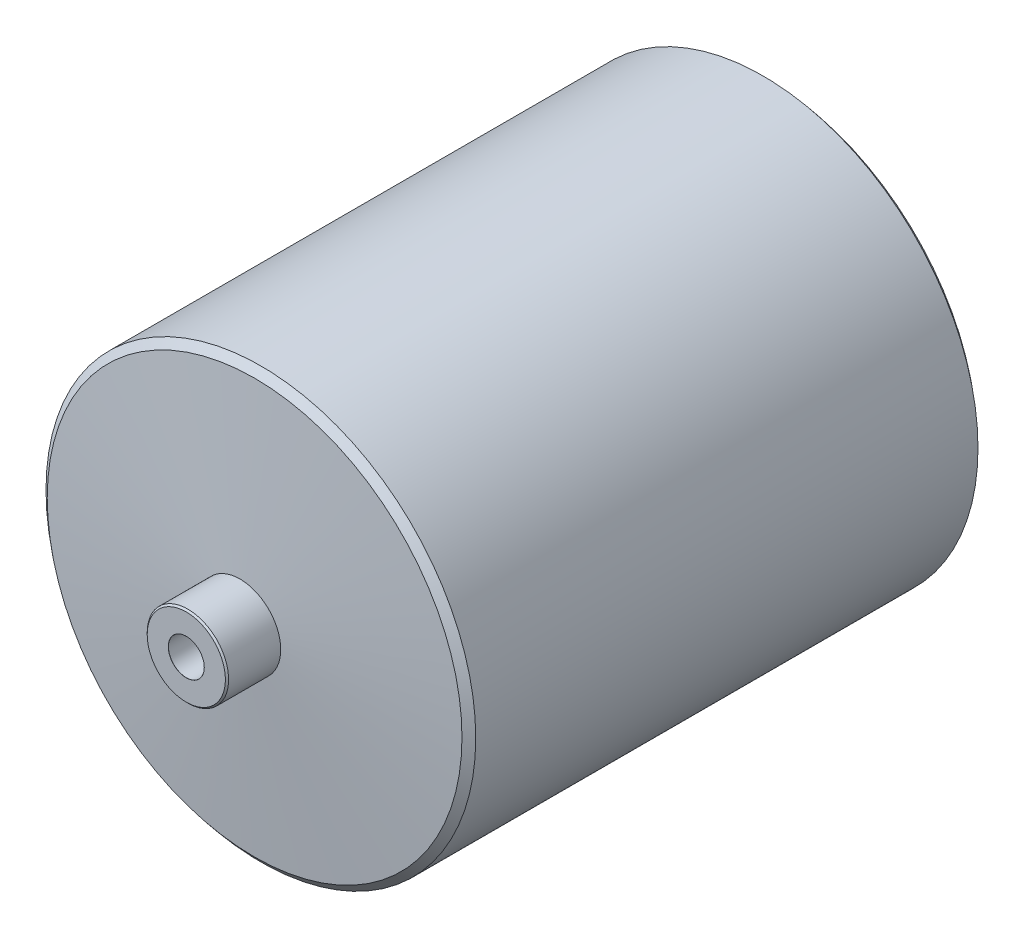
ISO-10303-21;
HEADER;
FILE_DESCRIPTION(('STEP AP214'),'2;1');
FILE_NAME('part.step','',(''),(''),'','','');
FILE_SCHEMA(('AUTOMOTIVE_DESIGN { 1 0 10303 214 1 1 1 1 }'));
ENDSEC;
DATA;
#1=APPLICATION_CONTEXT('core data for automotive mechanical design processes');
#2=APPLICATION_PROTOCOL_DEFINITION('international standard','automotive_design',2000,#1);
#3=PRODUCT_CONTEXT('',#1,'mechanical');
#4=PRODUCT('Part','Part','',(#3));
#5=PRODUCT_RELATED_PRODUCT_CATEGORY('part','',(#4));
#6=PRODUCT_DEFINITION_FORMATION('','',#4);
#7=PRODUCT_DEFINITION_CONTEXT('part definition',#1,'design');
#8=PRODUCT_DEFINITION('design','',#6,#7);
#9=PRODUCT_DEFINITION_SHAPE('','',#8);
#10=(LENGTH_UNIT() NAMED_UNIT(*) SI_UNIT(.MILLI.,.METRE.));
#11=(NAMED_UNIT(*) PLANE_ANGLE_UNIT() SI_UNIT($,.RADIAN.));
#12=(NAMED_UNIT(*) SI_UNIT($,.STERADIAN.) SOLID_ANGLE_UNIT());
#13=UNCERTAINTY_MEASURE_WITH_UNIT(LENGTH_MEASURE(1.E-05),#10,'distance_accuracy_value','');
#14=(GEOMETRIC_REPRESENTATION_CONTEXT(3) GLOBAL_UNCERTAINTY_ASSIGNED_CONTEXT((#13)) GLOBAL_UNIT_ASSIGNED_CONTEXT((#10,
#11,#12)) REPRESENTATION_CONTEXT('',''));
#15=CARTESIAN_POINT('',(0.,0.,0.));
#16=DIRECTION('',(0.,0.,1.));
#17=DIRECTION('',(1.,0.,0.));
#18=AXIS2_PLACEMENT_3D('',#15,#16,#17);
#19=CARTESIAN_POINT('',(0.,12.5,100.));
#20=DIRECTION('',(0.,0.,-1.));
#21=DIRECTION('',(-1.,0.,0.));
#22=AXIS2_PLACEMENT_3D('',#19,#20,#21);
#23=PLANE('',#22);
#24=CARTESIAN_POINT('',(0.,0.,100.));
#25=DIRECTION('',(0.,0.,-1.));
#26=DIRECTION('',(-1.,0.,0.));
#27=AXIS2_PLACEMENT_3D('',#24,#25,#26);
#28=CIRCLE('',#27,12.0000000000001);
#29=CARTESIAN_POINT('',(-12.0000000000001,0.,100.));
#30=VERTEX_POINT('',#29);
#31=EDGE_CURVE('E49',#30,#30,#28,.F.);
#32=ORIENTED_EDGE('',*,*,#31,.T.);
#33=EDGE_LOOP('',(#32));
#34=FACE_BOUND('',#33,.T.);
#35=CARTESIAN_POINT('',(0.,0.,100.));
#36=DIRECTION('',(0.,0.,1.));
#37=DIRECTION('',(1.,0.,0.));
#38=AXIS2_PLACEMENT_3D('',#35,#36,#37);
#39=CIRCLE('',#38,5.525);
#40=CARTESIAN_POINT('',(5.525,0.,100.));
#41=VERTEX_POINT('',#40);
#42=EDGE_CURVE('E65',#41,#41,#39,.T.);
#43=ORIENTED_EDGE('',*,*,#42,.F.);
#44=EDGE_LOOP('',(#43));
#45=FACE_BOUND('',#44,.T.);
#46=ADVANCED_FACE('F40',(#34,#45),#23,.F.);
#47=CARTESIAN_POINT('',(0.,12.5,-100.));
#48=DIRECTION('',(0.,0.,1.));
#49=DIRECTION('',(1.,0.,0.));
#50=AXIS2_PLACEMENT_3D('',#47,#48,#49);
#51=PLANE('',#50);
#52=CARTESIAN_POINT('',(0.,0.,-100.));
#53=DIRECTION('',(0.,0.,1.));
#54=DIRECTION('',(1.,0.,0.));
#55=AXIS2_PLACEMENT_3D('',#52,#53,#54);
#56=CIRCLE('',#55,12.);
#57=CARTESIAN_POINT('',(12.,0.,-100.));
#58=VERTEX_POINT('',#57);
#59=EDGE_CURVE('E102',#58,#58,#56,.F.);
#60=ORIENTED_EDGE('',*,*,#59,.T.);
#61=EDGE_LOOP('',(#60));
#62=FACE_BOUND('',#61,.T.);
#63=CARTESIAN_POINT('',(0.,0.,-100.));
#64=DIRECTION('',(0.,0.,-1.));
#65=DIRECTION('',(-1.,0.,0.));
#66=AXIS2_PLACEMENT_3D('',#63,#64,#65);
#67=CIRCLE('',#66,5.525);
#68=CARTESIAN_POINT('',(-5.525,0.,-100.));
#69=VERTEX_POINT('',#68);
#70=EDGE_CURVE('E72',#69,#69,#67,.T.);
#71=ORIENTED_EDGE('',*,*,#70,.F.);
#72=EDGE_LOOP('',(#71));
#73=FACE_BOUND('',#72,.T.);
#74=ADVANCED_FACE('F119',(#62,#73),#51,.F.);
#75=CARTESIAN_POINT('',(0.,0.,100.));
#76=DIRECTION('',(0.,0.,1.));
#77=DIRECTION('',(1.,0.,0.));
#78=AXIS2_PLACEMENT_3D('',#75,#76,#77);
#79=CYLINDRICAL_SURFACE('',#78,12.5);
#80=CARTESIAN_POINT('',(0.,0.,-99.5));
#81=DIRECTION('',(0.,0.,1.));
#82=DIRECTION('',(1.,0.,0.));
#83=AXIS2_PLACEMENT_3D('',#80,#81,#82);
#84=CIRCLE('',#83,12.5);
#85=CARTESIAN_POINT('',(12.5,0.,-99.5));
#86=VERTEX_POINT('',#85);
#87=EDGE_CURVE('E99',#86,#86,#84,.T.);
#88=ORIENTED_EDGE('',*,*,#87,.T.);
#89=EDGE_LOOP('',(#88));
#90=FACE_BOUND('',#89,.T.);
#91=CARTESIAN_POINT('',(0.,0.,-83.5));
#92=DIRECTION('',(0.,0.,1.));
#93=DIRECTION('',(1.,0.,0.));
#94=AXIS2_PLACEMENT_3D('',#91,#92,#93);
#95=CIRCLE('',#94,12.5);
#96=CARTESIAN_POINT('',(12.4999999999999,0.,-83.5));
#97=VERTEX_POINT('',#96);
#98=EDGE_CURVE('E96',#97,#97,#95,.T.);
#99=ORIENTED_EDGE('',*,*,#98,.F.);
#100=EDGE_LOOP('',(#99));
#101=FACE_BOUND('',#100,.T.);
#102=ADVANCED_FACE('F124',(#90,#101),#79,.T.);
#103=CARTESIAN_POINT('',(0.,0.,-83.5));
#104=DIRECTION('',(0.,0.,1.));
#105=DIRECTION('',(1.,0.,0.));
#106=AXIS2_PLACEMENT_3D('',#103,#104,#105);
#107=CONICAL_SURFACE('',#106,12.5,1.48352986419518);
#108=CARTESIAN_POINT('',(0.,0.,-79.0234400189501));
#109=DIRECTION('',(0.,0.,1.));
#110=DIRECTION('',(1.,0.,0.));
#111=AXIS2_PLACEMENT_3D('',#108,#109,#110);
#112=CIRCLE('',#111,63.6673147198462);
#113=CARTESIAN_POINT('',(63.6673147198461,0.,-79.0234400189501));
#114=VERTEX_POINT('',#113);
#115=EDGE_CURVE('E93',#114,#114,#112,.T.);
#116=CARTESIAN_POINT('',(63.6673147198461,0.,-79.0234400189501));
#117=CARTESIAN_POINT('',(63.1343218581811,0.,-79.070070852086));
#118=CARTESIAN_POINT('',(62.601328996516,0.,-79.116701685222));
#119=CARTESIAN_POINT('',(61.5353432731859,0.,-79.2099633514939));
#120=CARTESIAN_POINT('',(61.0023504115208,0.,-79.2565941846298));
#121=CARTESIAN_POINT('',(59.9363646881907,0.,-79.3498558509017));
#122=CARTESIAN_POINT('',(59.4033718265256,0.,-79.3964866840376));
#123=CARTESIAN_POINT('',(58.3373861031955,0.,-79.4897483503095));
#124=CARTESIAN_POINT('',(57.8043932415304,0.,-79.5363791834454));
#125=CARTESIAN_POINT('',(56.7384075182003,0.,-79.6296408497173));
#126=CARTESIAN_POINT('',(56.2054146565352,0.,-79.6762716828532));
#127=CARTESIAN_POINT('',(55.1394289332051,0.,-79.7695333491251));
#128=CARTESIAN_POINT('',(54.60643607154,0.,-79.816164182261));
#129=CARTESIAN_POINT('',(53.5404503482099,0.,-79.9094258485329));
#130=CARTESIAN_POINT('',(53.0074574865448,0.,-79.9560566816688));
#131=CARTESIAN_POINT('',(51.9414717632147,0.,-80.0493183479407));
#132=CARTESIAN_POINT('',(51.4084789015496,0.,-80.0959491810766));
#133=CARTESIAN_POINT('',(50.3424931782195,0.,-80.1892108473485));
#134=CARTESIAN_POINT('',(49.8095003165544,0.,-80.2358416804845));
#135=CARTESIAN_POINT('',(48.7435145932243,0.,-80.3291033467563));
#136=CARTESIAN_POINT('',(48.2105217315592,0.,-80.3757341798923));
#137=CARTESIAN_POINT('',(47.1445360082291,0.,-80.4689958461641));
#138=CARTESIAN_POINT('',(46.6115431465641,0.,-80.5156266793001));
#139=CARTESIAN_POINT('',(45.5455574232339,0.,-80.608888345572));
#140=CARTESIAN_POINT('',(45.0125645615689,0.,-80.6555191787079));
#141=CARTESIAN_POINT('',(43.9465788382387,0.,-80.7487808449798));
#142=CARTESIAN_POINT('',(43.4135859765737,0.,-80.7954116781157));
#143=CARTESIAN_POINT('',(42.3476002532435,0.,-80.8886733443876));
#144=CARTESIAN_POINT('',(41.8146073915785,0.,-80.9353041775235));
#145=CARTESIAN_POINT('',(40.7486216682484,0.,-81.0285658437954));
#146=CARTESIAN_POINT('',(40.2156288065833,0.,-81.0751966769313));
#147=CARTESIAN_POINT('',(39.1496430832532,0.,-81.1684583432032));
#148=CARTESIAN_POINT('',(38.6166502215881,0.,-81.2150891763391));
#149=CARTESIAN_POINT('',(37.550664498258,0.,-81.308350842611));
#150=CARTESIAN_POINT('',(37.0176716365929,0.,-81.3549816757469));
#151=CARTESIAN_POINT('',(35.9516859132628,0.,-81.4482433420188));
#152=CARTESIAN_POINT('',(35.4186930515977,0.,-81.4948741751547));
#153=CARTESIAN_POINT('',(34.3527073282676,0.,-81.5881358414266));
#154=CARTESIAN_POINT('',(33.8197144666025,0.,-81.6347666745625));
#155=CARTESIAN_POINT('',(32.7537287432724,0.,-81.7280283408344));
#156=CARTESIAN_POINT('',(32.2207358816073,0.,-81.7746591739704));
#157=CARTESIAN_POINT('',(31.1547501582772,0.,-81.8679208402422));
#158=CARTESIAN_POINT('',(30.6217572966121,0.,-81.9145516733782));
#159=CARTESIAN_POINT('',(29.555771573282,0.,-82.00781333965));
#160=CARTESIAN_POINT('',(29.0227787116169,0.,-82.054444172786));
#161=CARTESIAN_POINT('',(27.9567929882868,0.,-82.1477058390579));
#162=CARTESIAN_POINT('',(27.4238001266217,0.,-82.1943366721938));
#163=CARTESIAN_POINT('',(26.3578144032916,0.,-82.2875983384657));
#164=CARTESIAN_POINT('',(25.8248215416265,0.,-82.3342291716016));
#165=CARTESIAN_POINT('',(24.7588358182964,0.,-82.4274908378735));
#166=CARTESIAN_POINT('',(24.2258429566313,0.,-82.4741216710094));
#167=CARTESIAN_POINT('',(23.1598572333012,0.,-82.5673833372813));
#168=CARTESIAN_POINT('',(22.6268643716361,0.,-82.6140141704172));
#169=CARTESIAN_POINT('',(21.560878648306,0.,-82.7072758366891));
#170=CARTESIAN_POINT('',(21.027885786641,0.,-82.753906669825));
#171=CARTESIAN_POINT('',(19.9619000633108,0.,-82.8471683360969));
#172=CARTESIAN_POINT('',(19.4289072016458,0.,-82.8937991692328));
#173=CARTESIAN_POINT('',(18.3629214783156,0.,-82.9870608355047));
#174=CARTESIAN_POINT('',(17.8299286166506,0.,-83.0336916686406));
#175=CARTESIAN_POINT('',(16.7639428933204,0.,-83.1269533349125));
#176=CARTESIAN_POINT('',(16.2309500316554,0.,-83.1735841680485));
#177=CARTESIAN_POINT('',(15.1649643083252,0.,-83.2668458343203));
#178=CARTESIAN_POINT('',(14.6319714466602,0.,-83.3134766674563));
#179=CARTESIAN_POINT('',(13.56598572333,0.,-83.4067383337281));
#180=CARTESIAN_POINT('',(13.032992861665,0.,-83.4533691668641));
#181=CARTESIAN_POINT('',(12.4999999999999,0.,-83.5));
#182=B_SPLINE_CURVE_WITH_KNOTS('',3,(#116,#117,#118,#119,#120,#121,#122,#123,#124,#125,#126,
#127,#128,#129,#130,#131,#132,#133,#134,#135,#136,#137,#138,#139,#140,#141,#142,#143,#144,#145,
#146,#147,#148,#149,#150,#151,#152,#153,#154,#155,#156,#157,#158,#159,#160,#161,#162,#163,#164,
#165,#166,#167,#168,#169,#170,#171,#172,#173,#174,#175,#176,#177,#178,#179,#180,#181),
.UNSPECIFIED.,.F.,.F.,(4,2,2,2,2,2,2,2,2,2,2,2,2,2,2,2,2,2,2,2,2,2,2,2,2,2,2,2,2,2,2,2,4),(0.,
1.60508642342516,3.21017284685033,4.8152592702755,6.42034569370068,8.02543211712584,
9.63051854055101,11.2356049639762,12.8406913874013,14.4457778108265,16.0508642342517,
17.6559506576769,19.261037081102,20.8661235045272,22.4712099279523,24.0762963513775,
25.6813827748027,27.2864691982279,28.891555621653,30.4966420450782,32.1017284685034,
33.7068148919285,35.3119013153537,36.9169877387789,38.522074162204,40.1271605856292,
41.7322470090544,43.3373334324795,44.9424198559047,46.5475062793299,48.152592702755,
49.7576791261802,51.3627655496054),.UNSPECIFIED.);
#183=EDGE_CURVE('BSEAM135',#114,#97,#182,.T.);
#184=ORIENTED_EDGE('',*,*,#115,.F.);
#185=ORIENTED_EDGE('',*,*,#98,.T.);
#186=ORIENTED_EDGE('',*,*,#183,.T.);
#187=ORIENTED_EDGE('',*,*,#183,.F.);
#188=EDGE_LOOP('',(#184,#186,#185,#187));
#189=FACE_BOUND('',#188,.T.);
#190=ADVANCED_FACE('F135',(#189),#107,.T.);
#191=CARTESIAN_POINT('',(0.,0.,-79.0234400189501));
#192=DIRECTION('',(0.,0.,1.));
#193=DIRECTION('',(1.,0.,0.));
#194=AXIS2_PLACEMENT_3D('',#191,#192,#193);
#195=CONICAL_SURFACE('',#194,63.6673147198462,0.873723862747896);
#196=CARTESIAN_POINT('',(0.,0.,-77.0975125385104));
#197=DIRECTION('',(0.,0.,1.));
#198=DIRECTION('',(1.,0.,0.));
#199=AXIS2_PLACEMENT_3D('',#196,#197,#198);
#200=CIRCLE('',#199,65.9674893523659);
#201=CARTESIAN_POINT('',(65.9674893523659,0.,-77.0975125385104));
#202=VERTEX_POINT('',#201);
#203=EDGE_CURVE('E90',#202,#202,#200,.T.);
#204=ORIENTED_EDGE('',*,*,#203,.F.);
#205=EDGE_LOOP('',(#204));
#206=FACE_BOUND('',#205,.T.);
#207=ORIENTED_EDGE('',*,*,#115,.T.);
#208=EDGE_LOOP('',(#207));
#209=FACE_BOUND('',#208,.T.);
#210=ADVANCED_FACE('F139',(#206,#209),#195,.T.);
#211=CARTESIAN_POINT('',(0.,0.,100.));
#212=DIRECTION('',(0.,0.,1.));
#213=DIRECTION('',(1.,0.,0.));
#214=AXIS2_PLACEMENT_3D('',#211,#212,#213);
#215=CYLINDRICAL_SURFACE('',#214,65.9674893523659);
#216=CARTESIAN_POINT('',(0.,0.,77.0975125385104));
#217=DIRECTION('',(0.,0.,1.));
#218=DIRECTION('',(1.,0.,0.));
#219=AXIS2_PLACEMENT_3D('',#216,#217,#218);
#220=CIRCLE('',#219,65.967489352366);
#221=CARTESIAN_POINT('',(65.967489352366,0.,77.0975125385104));
#222=VERTEX_POINT('',#221);
#223=EDGE_CURVE('E87',#222,#222,#220,.T.);
#224=ORIENTED_EDGE('',*,*,#223,.F.);
#225=EDGE_LOOP('',(#224));
#226=FACE_BOUND('',#225,.T.);
#227=ORIENTED_EDGE('',*,*,#203,.T.);
#228=EDGE_LOOP('',(#227));
#229=FACE_BOUND('',#228,.T.);
#230=ADVANCED_FACE('F143',(#226,#229),#215,.T.);
#231=CARTESIAN_POINT('',(0.,0.,77.0975125385104));
#232=DIRECTION('',(0.,0.,-1.));
#233=DIRECTION('',(-1.,0.,0.));
#234=AXIS2_PLACEMENT_3D('',#231,#232,#233);
#235=CONICAL_SURFACE('',#234,65.967489352366,0.873723862747893);
#236=CARTESIAN_POINT('',(0.,0.,79.0234400189501));
#237=DIRECTION('',(0.,0.,1.));
#238=DIRECTION('',(1.,0.,0.));
#239=AXIS2_PLACEMENT_3D('',#236,#237,#238);
#240=CIRCLE('',#239,63.6673147198463);
#241=CARTESIAN_POINT('',(-63.6673147198464,0.,79.0234400189501));
#242=VERTEX_POINT('',#241);
#243=EDGE_CURVE('E84',#242,#242,#240,.T.);
#244=ORIENTED_EDGE('',*,*,#243,.F.);
#245=EDGE_LOOP('',(#244));
#246=FACE_BOUND('',#245,.T.);
#247=ORIENTED_EDGE('',*,*,#223,.T.);
#248=EDGE_LOOP('',(#247));
#249=FACE_BOUND('',#248,.T.);
#250=ADVANCED_FACE('F147',(#246,#249),#235,.T.);
#251=CARTESIAN_POINT('',(0.,0.,79.0234400189501));
#252=DIRECTION('',(0.,0.,-1.));
#253=DIRECTION('',(-1.,0.,0.));
#254=AXIS2_PLACEMENT_3D('',#251,#252,#253);
#255=CONICAL_SURFACE('',#254,63.6673147198463,1.48352986419518);
#256=CARTESIAN_POINT('',(0.,0.,83.5));
#257=DIRECTION('',(0.,0.,1.));
#258=DIRECTION('',(1.,0.,0.));
#259=AXIS2_PLACEMENT_3D('',#256,#257,#258);
#260=CIRCLE('',#259,12.5);
#261=CARTESIAN_POINT('',(-12.5,0.,83.5));
#262=VERTEX_POINT('',#261);
#263=EDGE_CURVE('E81',#262,#262,#260,.T.);
#264=CARTESIAN_POINT('',(-12.5,0.,83.5));
#265=CARTESIAN_POINT('',(-13.0329928616651,0.,83.4533691668641));
#266=CARTESIAN_POINT('',(-13.5659857233302,0.,83.4067383337281));
#267=CARTESIAN_POINT('',(-14.6319714466603,0.,83.3134766674563));
#268=CARTESIAN_POINT('',(-15.1649643083254,0.,83.2668458343203));
#269=CARTESIAN_POINT('',(-16.2309500316555,0.,83.1735841680485));
#270=CARTESIAN_POINT('',(-16.7639428933205,0.,83.1269533349125));
#271=CARTESIAN_POINT('',(-17.8299286166507,0.,83.0336916686406));
#272=CARTESIAN_POINT('',(-18.3629214783157,0.,82.9870608355047));
#273=CARTESIAN_POINT('',(-19.4289072016459,0.,82.8937991692328));
#274=CARTESIAN_POINT('',(-19.9619000633109,0.,82.8471683360969));
#275=CARTESIAN_POINT('',(-21.0278857866411,0.,82.753906669825));
#276=CARTESIAN_POINT('',(-21.5608786483061,0.,82.7072758366891));
#277=CARTESIAN_POINT('',(-22.6268643716363,0.,82.6140141704172));
#278=CARTESIAN_POINT('',(-23.1598572333013,0.,82.5673833372813));
#279=CARTESIAN_POINT('',(-24.2258429566315,0.,82.4741216710094));
#280=CARTESIAN_POINT('',(-24.7588358182965,0.,82.4274908378735));
#281=CARTESIAN_POINT('',(-25.8248215416267,0.,82.3342291716016));
#282=CARTESIAN_POINT('',(-26.3578144032917,0.,82.2875983384657));
#283=CARTESIAN_POINT('',(-27.4238001266219,0.,82.1943366721938));
#284=CARTESIAN_POINT('',(-27.9567929882869,0.,82.1477058390579));
#285=CARTESIAN_POINT('',(-29.0227787116171,0.,82.054444172786));
#286=CARTESIAN_POINT('',(-29.5557715732821,0.,82.00781333965));
#287=CARTESIAN_POINT('',(-30.6217572966123,0.,81.9145516733782));
#288=CARTESIAN_POINT('',(-31.1547501582773,0.,81.8679208402422));
#289=CARTESIAN_POINT('',(-32.2207358816075,0.,81.7746591739704));
#290=CARTESIAN_POINT('',(-32.7537287432725,0.,81.7280283408344));
#291=CARTESIAN_POINT('',(-33.8197144666027,0.,81.6347666745625));
#292=CARTESIAN_POINT('',(-34.3527073282677,0.,81.5881358414266));
#293=CARTESIAN_POINT('',(-35.4186930515979,0.,81.4948741751547));
#294=CARTESIAN_POINT('',(-35.9516859132629,0.,81.4482433420188));
#295=CARTESIAN_POINT('',(-37.0176716365931,0.,81.3549816757469));
#296=CARTESIAN_POINT('',(-37.5506644982581,0.,81.308350842611));
#297=CARTESIAN_POINT('',(-38.6166502215883,0.,81.2150891763391));
#298=CARTESIAN_POINT('',(-39.1496430832533,0.,81.1684583432032));
#299=CARTESIAN_POINT('',(-40.2156288065835,0.,81.0751966769313));
#300=CARTESIAN_POINT('',(-40.7486216682485,0.,81.0285658437954));
#301=CARTESIAN_POINT('',(-41.8146073915787,0.,80.9353041775235));
#302=CARTESIAN_POINT('',(-42.3476002532437,0.,80.8886733443876));
#303=CARTESIAN_POINT('',(-43.4135859765739,0.,80.7954116781157));
#304=CARTESIAN_POINT('',(-43.9465788382389,0.,80.7487808449798));
#305=CARTESIAN_POINT('',(-45.0125645615691,0.,80.6555191787079));
#306=CARTESIAN_POINT('',(-45.5455574232341,0.,80.608888345572));
#307=CARTESIAN_POINT('',(-46.6115431465642,0.,80.5156266793001));
#308=CARTESIAN_POINT('',(-47.1445360082293,0.,80.4689958461641));
#309=CARTESIAN_POINT('',(-48.2105217315594,0.,80.3757341798923));
#310=CARTESIAN_POINT('',(-48.7435145932245,0.,80.3291033467563));
#311=CARTESIAN_POINT('',(-49.8095003165546,0.,80.2358416804845));
#312=CARTESIAN_POINT('',(-50.3424931782197,0.,80.1892108473485));
#313=CARTESIAN_POINT('',(-51.4084789015498,0.,80.0959491810766));
#314=CARTESIAN_POINT('',(-51.9414717632149,0.,80.0493183479407));
#315=CARTESIAN_POINT('',(-53.007457486545,0.,79.9560566816688));
#316=CARTESIAN_POINT('',(-53.5404503482101,0.,79.9094258485329));
#317=CARTESIAN_POINT('',(-54.6064360715402,0.,79.816164182261));
#318=CARTESIAN_POINT('',(-55.1394289332053,0.,79.7695333491251));
#319=CARTESIAN_POINT('',(-56.2054146565354,0.,79.6762716828532));
#320=CARTESIAN_POINT('',(-56.7384075182005,0.,79.6296408497173));
#321=CARTESIAN_POINT('',(-57.8043932415306,0.,79.5363791834454));
#322=CARTESIAN_POINT('',(-58.3373861031957,0.,79.4897483503095));
#323=CARTESIAN_POINT('',(-59.4033718265258,0.,79.3964866840376));
#324=CARTESIAN_POINT('',(-59.9363646881909,0.,79.3498558509017));
#325=CARTESIAN_POINT('',(-61.002350411521,0.,79.2565941846298));
#326=CARTESIAN_POINT('',(-61.5353432731861,0.,79.2099633514939));
#327=CARTESIAN_POINT('',(-62.6013289965162,0.,79.116701685222));
#328=CARTESIAN_POINT('',(-63.1343218581813,0.,79.070070852086));
#329=CARTESIAN_POINT('',(-63.6673147198464,0.,79.0234400189501));
#330=B_SPLINE_CURVE_WITH_KNOTS('',3,(#264,#265,#266,#267,#268,#269,#270,#271,#272,#273,#274,
#275,#276,#277,#278,#279,#280,#281,#282,#283,#284,#285,#286,#287,#288,#289,#290,#291,#292,#293,
#294,#295,#296,#297,#298,#299,#300,#301,#302,#303,#304,#305,#306,#307,#308,#309,#310,#311,#312,
#313,#314,#315,#316,#317,#318,#319,#320,#321,#322,#323,#324,#325,#326,#327,#328,#329),
.UNSPECIFIED.,.F.,.F.,(4,2,2,2,2,2,2,2,2,2,2,2,2,2,2,2,2,2,2,2,2,2,2,2,2,2,2,2,2,2,2,2,4),(0.,
1.60508642342517,3.21017284685035,4.81525927027552,6.42034569370069,8.02543211712586,
9.63051854055103,11.2356049639762,12.8406913874014,14.4457778108266,16.0508642342517,
17.6559506576769,19.2610370811021,20.8661235045272,22.4712099279524,24.0762963513776,
25.6813827748028,27.2864691982279,28.8915556216531,30.4966420450783,32.1017284685034,
33.7068148919286,35.3119013153538,36.916987738779,38.5220741622041,40.1271605856293,
41.7322470090545,43.3373334324796,44.9424198559048,46.54750627933,48.1525927027552,
49.7576791261803,51.3627655496055),.UNSPECIFIED.);
#331=EDGE_CURVE('BSEAM151',#262,#242,#330,.T.);
#332=ORIENTED_EDGE('',*,*,#263,.F.);
#333=ORIENTED_EDGE('',*,*,#243,.T.);
#334=ORIENTED_EDGE('',*,*,#331,.T.);
#335=ORIENTED_EDGE('',*,*,#331,.F.);
#336=EDGE_LOOP('',(#332,#334,#333,#335));
#337=FACE_BOUND('',#336,.T.);
#338=ADVANCED_FACE('F151',(#337),#255,.T.);
#339=CARTESIAN_POINT('',(0.,0.,100.));
#340=DIRECTION('',(0.,0.,1.));
#341=DIRECTION('',(1.,0.,0.));
#342=AXIS2_PLACEMENT_3D('',#339,#340,#341);
#343=CYLINDRICAL_SURFACE('',#342,12.5);
#344=CARTESIAN_POINT('',(0.,0.,99.5));
#345=DIRECTION('',(0.,0.,-1.));
#346=DIRECTION('',(-1.,0.,0.));
#347=AXIS2_PLACEMENT_3D('',#344,#345,#346);
#348=CIRCLE('',#347,12.5);
#349=CARTESIAN_POINT('',(-12.5,0.,99.5));
#350=VERTEX_POINT('',#349);
#351=EDGE_CURVE('E11',#350,#350,#348,.T.);
#352=ORIENTED_EDGE('',*,*,#351,.T.);
#353=EDGE_LOOP('',(#352));
#354=FACE_BOUND('',#353,.T.);
#355=ORIENTED_EDGE('',*,*,#263,.T.);
#356=EDGE_LOOP('',(#355));
#357=FACE_BOUND('',#356,.T.);
#358=ADVANCED_FACE('F155',(#354,#357),#343,.T.);
#359=CARTESIAN_POINT('',(0.,0.,44.3047334046516));
#360=DIRECTION('',(0.,0.,1.));
#361=DIRECTION('',(1.,0.,0.));
#362=AXIS2_PLACEMENT_3D('',#359,#360,#361);
#363=CONICAL_SURFACE('',#362,5.49999999999999,1.02974425867665);
#364=CARTESIAN_POINT('',(0.,0.,41.));
#365=VERTEX_POINT('',#364);
#366=VERTEX_LOOP('',#365);
#367=FACE_BOUND('',#366,.T.);
#368=CARTESIAN_POINT('',(0.,0.,44.3047334046516));
#369=DIRECTION('',(0.,0.,1.));
#370=DIRECTION('',(1.,0.,0.));
#371=AXIS2_PLACEMENT_3D('',#368,#369,#370);
#372=CIRCLE('',#371,5.49999999999999);
#373=CARTESIAN_POINT('',(5.49999999999999,0.,44.3047334046516));
#374=VERTEX_POINT('',#373);
#375=EDGE_CURVE('E78',#374,#374,#372,.T.);
#376=ORIENTED_EDGE('',*,*,#375,.T.);
#377=EDGE_LOOP('',(#376));
#378=FACE_BOUND('',#377,.T.);
#379=ADVANCED_FACE('F159',(#367,#378),#363,.F.);
#380=CARTESIAN_POINT('',(0.,0.,100.));
#381=DIRECTION('',(0.,0.,1.));
#382=DIRECTION('',(1.,0.,0.));
#383=AXIS2_PLACEMENT_3D('',#380,#381,#382);
#384=CYLINDRICAL_SURFACE('',#383,5.49999999999999);
#385=ORIENTED_EDGE('',*,*,#375,.F.);
#386=EDGE_LOOP('',(#385));
#387=FACE_BOUND('',#386,.T.);
#388=CARTESIAN_POINT('',(0.,0.,99.975));
#389=DIRECTION('',(0.,0.,1.));
#390=DIRECTION('',(1.,0.,0.));
#391=AXIS2_PLACEMENT_3D('',#388,#389,#390);
#392=CIRCLE('',#391,5.49999999999999);
#393=CARTESIAN_POINT('',(5.49999999999999,0.,99.975));
#394=VERTEX_POINT('',#393);
#395=EDGE_CURVE('E69',#394,#394,#392,.T.);
#396=ORIENTED_EDGE('',*,*,#395,.T.);
#397=EDGE_LOOP('',(#396));
#398=FACE_BOUND('',#397,.T.);
#399=ADVANCED_FACE('F163',(#387,#398),#384,.F.);
#400=CARTESIAN_POINT('',(0.,0.,100.));
#401=DIRECTION('',(0.,0.,1.));
#402=DIRECTION('',(1.,0.,0.));
#403=AXIS2_PLACEMENT_3D('',#400,#401,#402);
#404=CONICAL_SURFACE('',#403,5.525,0.785398163397379);
#405=ORIENTED_EDGE('',*,*,#395,.F.);
#406=EDGE_LOOP('',(#405));
#407=FACE_BOUND('',#406,.T.);
#408=ORIENTED_EDGE('',*,*,#42,.T.);
#409=EDGE_LOOP('',(#408));
#410=FACE_BOUND('',#409,.T.);
#411=ADVANCED_FACE('F59',(#407,#410),#404,.F.);
#412=CARTESIAN_POINT('',(0.,0.,-44.3047334046516));
#413=DIRECTION('',(0.,0.,-1.));
#414=DIRECTION('',(-1.,0.,0.));
#415=AXIS2_PLACEMENT_3D('',#412,#413,#414);
#416=CONICAL_SURFACE('',#415,5.49999999999999,1.02974425867665);
#417=CARTESIAN_POINT('',(0.,0.,-41.));
#418=VERTEX_POINT('',#417);
#419=VERTEX_LOOP('',#418);
#420=FACE_BOUND('',#419,.T.);
#421=CARTESIAN_POINT('',(0.,0.,-44.3047334046516));
#422=DIRECTION('',(0.,0.,-1.));
#423=DIRECTION('',(-1.,0.,0.));
#424=AXIS2_PLACEMENT_3D('',#421,#422,#423);
#425=CIRCLE('',#424,5.49999999999999);
#426=CARTESIAN_POINT('',(-5.49999999999999,0.,-44.3047334046516));
#427=VERTEX_POINT('',#426);
#428=EDGE_CURVE('E63',#427,#427,#425,.T.);
#429=ORIENTED_EDGE('',*,*,#428,.T.);
#430=EDGE_LOOP('',(#429));
#431=FACE_BOUND('',#430,.T.);
#432=ADVANCED_FACE('F55',(#420,#431),#416,.F.);
#433=CARTESIAN_POINT('',(0.,0.,-100.));
#434=DIRECTION('',(0.,0.,-1.));
#435=DIRECTION('',(-1.,0.,0.));
#436=AXIS2_PLACEMENT_3D('',#433,#434,#435);
#437=CYLINDRICAL_SURFACE('',#436,5.49999999999999);
#438=ORIENTED_EDGE('',*,*,#428,.F.);
#439=EDGE_LOOP('',(#438));
#440=FACE_BOUND('',#439,.T.);
#441=CARTESIAN_POINT('',(0.,0.,-99.975));
#442=DIRECTION('',(0.,0.,-1.));
#443=DIRECTION('',(-1.,0.,0.));
#444=AXIS2_PLACEMENT_3D('',#441,#442,#443);
#445=CIRCLE('',#444,5.49999999999999);
#446=CARTESIAN_POINT('',(-5.49999999999999,0.,-99.975));
#447=VERTEX_POINT('',#446);
#448=EDGE_CURVE('E66',#447,#447,#445,.T.);
#449=ORIENTED_EDGE('',*,*,#448,.T.);
#450=EDGE_LOOP('',(#449));
#451=FACE_BOUND('',#450,.T.);
#452=ADVANCED_FACE('F58',(#440,#451),#437,.F.);
#453=CARTESIAN_POINT('',(0.,0.,-100.));
#454=DIRECTION('',(0.,0.,-1.));
#455=DIRECTION('',(-1.,0.,0.));
#456=AXIS2_PLACEMENT_3D('',#453,#454,#455);
#457=CONICAL_SURFACE('',#456,5.525,0.785398163397379);
#458=ORIENTED_EDGE('',*,*,#448,.F.);
#459=EDGE_LOOP('',(#458));
#460=FACE_BOUND('',#459,.T.);
#461=ORIENTED_EDGE('',*,*,#70,.T.);
#462=EDGE_LOOP('',(#461));
#463=FACE_BOUND('',#462,.T.);
#464=ADVANCED_FACE('F115',(#460,#463),#457,.F.);
#465=CARTESIAN_POINT('',(0.,0.,-99.5));
#466=DIRECTION('',(0.,0.,1.));
#467=DIRECTION('',(1.,0.,0.));
#468=AXIS2_PLACEMENT_3D('',#465,#466,#467);
#469=CONICAL_SURFACE('',#468,12.5,0.785398163397431);
#470=ORIENTED_EDGE('',*,*,#59,.F.);
#471=EDGE_LOOP('',(#470));
#472=FACE_BOUND('',#471,.T.);
#473=ORIENTED_EDGE('',*,*,#87,.F.);
#474=EDGE_LOOP('',(#473));
#475=FACE_BOUND('',#474,.T.);
#476=ADVANCED_FACE('F110',(#472,#475),#469,.T.);
#477=CARTESIAN_POINT('',(0.,0.,100.));
#478=DIRECTION('',(0.,0.,-1.));
#479=DIRECTION('',(-1.,0.,0.));
#480=AXIS2_PLACEMENT_3D('',#477,#478,#479);
#481=CONICAL_SURFACE('',#480,12.0000000000001,0.785398163397438);
#482=ORIENTED_EDGE('',*,*,#351,.F.);
#483=EDGE_LOOP('',(#482));
#484=FACE_BOUND('',#483,.T.);
#485=ORIENTED_EDGE('',*,*,#31,.F.);
#486=EDGE_LOOP('',(#485));
#487=FACE_BOUND('',#486,.T.);
#488=ADVANCED_FACE('F43',(#484,#487),#481,.T.);
#489=CLOSED_SHELL('',(#46,#74,#102,#190,#210,#230,#250,#338,#358,#379,#399,#411,#432,#452,#464,
#476,#488));
#490=MANIFOLD_SOLID_BREP('B2',#489);
#491=ADVANCED_BREP_SHAPE_REPRESENTATION('',(#18,#490),#14);
#492=SHAPE_DEFINITION_REPRESENTATION(#9,#491);
ENDSEC;
END-ISO-10303-21;
